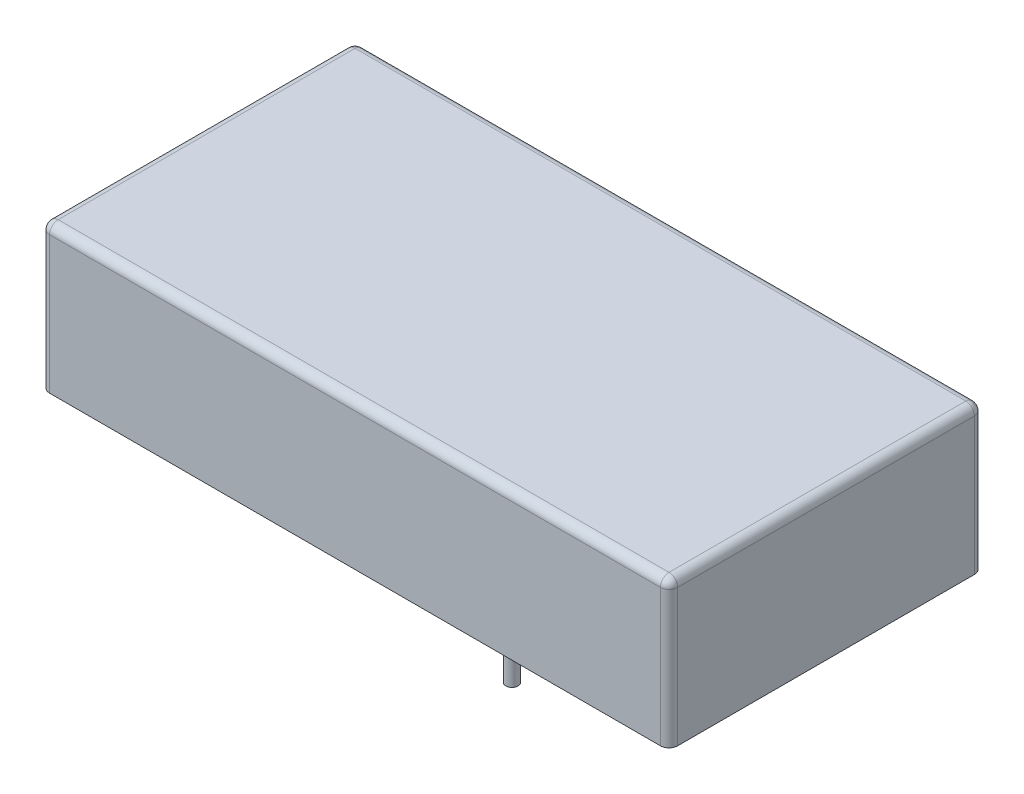
ISO-10303-21;
HEADER;
FILE_DESCRIPTION(('STEP AP214'),'2;1');
FILE_NAME('part.step','',(''),(''),'','','');
FILE_SCHEMA(('AUTOMOTIVE_DESIGN { 1 0 10303 214 1 1 1 1 }'));
ENDSEC;
DATA;
#1=APPLICATION_CONTEXT('core data for automotive mechanical design processes');
#2=APPLICATION_PROTOCOL_DEFINITION('international standard','automotive_design',2000,#1);
#3=PRODUCT_CONTEXT('',#1,'mechanical');
#4=PRODUCT('Part','Part','',(#3));
#5=PRODUCT_RELATED_PRODUCT_CATEGORY('part','',(#4));
#6=PRODUCT_DEFINITION_FORMATION('','',#4);
#7=PRODUCT_DEFINITION_CONTEXT('part definition',#1,'design');
#8=PRODUCT_DEFINITION('design','',#6,#7);
#9=PRODUCT_DEFINITION_SHAPE('','',#8);
#10=(LENGTH_UNIT() NAMED_UNIT(*) SI_UNIT(.MILLI.,.METRE.));
#11=(NAMED_UNIT(*) PLANE_ANGLE_UNIT() SI_UNIT($,.RADIAN.));
#12=(NAMED_UNIT(*) SI_UNIT($,.STERADIAN.) SOLID_ANGLE_UNIT());
#13=UNCERTAINTY_MEASURE_WITH_UNIT(LENGTH_MEASURE(1.E-05),#10,'distance_accuracy_value','');
#14=(GEOMETRIC_REPRESENTATION_CONTEXT(3) GLOBAL_UNCERTAINTY_ASSIGNED_CONTEXT((#13)) GLOBAL_UNIT_ASSIGNED_CONTEXT((#10,
#11,#12)) REPRESENTATION_CONTEXT('',''));
#15=CARTESIAN_POINT('',(0.,0.,0.));
#16=DIRECTION('',(0.,0.,1.));
#17=DIRECTION('',(1.,0.,0.));
#18=AXIS2_PLACEMENT_3D('',#15,#16,#17);
#19=CARTESIAN_POINT('',(20.3223872720577,19.9,2.30900937106401));
#20=DIRECTION('',(0.885738530445474,0.397567124128241,0.239598909631686));
#21=DIRECTION('',(0.2640178534715,-0.0069406075380161,-0.964492820613666));
#22=AXIS2_PLACEMENT_3D('',#19,#20,#21);
#23=SPHERICAL_SURFACE('',#22,0.7);
#24=CARTESIAN_POINT('',(20.9424042433696,20.1782969868898,2.47672860780619));
#25=VERTEX_POINT('',#24);
#26=VERTEX_LOOP('',#25);
#27=FACE_BOUND('',#26,.T.);
#28=CARTESIAN_POINT('',(20.3223872720577,19.9,2.30900937106401));
#29=DIRECTION('',(0.,1.,0.));
#30=DIRECTION('',(0.,0.,1.));
#31=AXIS2_PLACEMENT_3D('',#28,#29,#30);
#32=CIRCLE('',#31,0.699999999999999);
#33=CARTESIAN_POINT('',(21.0223872720577,19.9,2.30900937106401));
#34=VERTEX_POINT('',#33);
#35=CARTESIAN_POINT('',(20.3223872720577,19.9,3.00900937106401));
#36=VERTEX_POINT('',#35);
#37=EDGE_CURVE('E93',#34,#36,#32,.F.);
#38=ORIENTED_EDGE('',*,*,#37,.F.);
#39=CARTESIAN_POINT('',(20.3223872720577,19.9,2.30900937106401));
#40=DIRECTION('',(0.,0.,-1.));
#41=DIRECTION('',(-1.,0.,0.));
#42=AXIS2_PLACEMENT_3D('',#39,#40,#41);
#43=CIRCLE('',#42,0.699999999999999);
#44=CARTESIAN_POINT('',(20.3223872720577,20.6,2.30900937106401));
#45=VERTEX_POINT('',#44);
#46=EDGE_CURVE('E108',#45,#34,#43,.T.);
#47=ORIENTED_EDGE('',*,*,#46,.F.);
#48=CARTESIAN_POINT('',(20.3223872720577,19.9,2.30900937106401));
#49=DIRECTION('',(1.,0.,0.));
#50=DIRECTION('',(0.,0.,-1.));
#51=AXIS2_PLACEMENT_3D('',#48,#49,#50);
#52=CIRCLE('',#51,0.699999999999999);
#53=EDGE_CURVE('E20',#36,#45,#52,.F.);
#54=ORIENTED_EDGE('',*,*,#53,.F.);
#55=EDGE_LOOP('',(#38,#47,#54));
#56=FACE_BOUND('',#55,.T.);
#57=ADVANCED_FACE('F16',(#27,#56),#23,.T.);
#58=CARTESIAN_POINT('',(20.3223872720577,19.9,-21.690990628936));
#59=DIRECTION('',(0.885738530445474,0.397567124128241,0.239598909631686));
#60=DIRECTION('',(0.2640178534715,-0.0069406075380161,-0.964492820613666));
#61=AXIS2_PLACEMENT_3D('',#58,#59,#60);
#62=SPHERICAL_SURFACE('',#61,0.7);
#63=CARTESIAN_POINT('',(20.3223872720577,19.9,-21.690990628936));
#64=DIRECTION('',(0.,1.,0.));
#65=DIRECTION('',(0.,0.,1.));
#66=AXIS2_PLACEMENT_3D('',#63,#64,#65);
#67=CIRCLE('',#66,0.699999999999999);
#68=CARTESIAN_POINT('',(20.3223872720577,19.9,-22.390990628936));
#69=VERTEX_POINT('',#68);
#70=CARTESIAN_POINT('',(21.0223872720577,19.9,-21.690990628936));
#71=VERTEX_POINT('',#70);
#72=EDGE_CURVE('E214',#69,#71,#67,.F.);
#73=ORIENTED_EDGE('',*,*,#72,.F.);
#74=CARTESIAN_POINT('',(20.3223872720577,19.9,-21.690990628936));
#75=DIRECTION('',(-1.,0.,0.));
#76=DIRECTION('',(0.,0.,1.));
#77=AXIS2_PLACEMENT_3D('',#74,#75,#76);
#78=CIRCLE('',#77,0.699999999999999);
#79=CARTESIAN_POINT('',(20.3223872720577,20.6,-21.690990628936));
#80=VERTEX_POINT('',#79);
#81=EDGE_CURVE('E212',#80,#69,#78,.T.);
#82=ORIENTED_EDGE('',*,*,#81,.F.);
#83=CARTESIAN_POINT('',(20.3223872720577,19.9,-21.690990628936));
#84=DIRECTION('',(0.,0.,-1.));
#85=DIRECTION('',(-1.,0.,0.));
#86=AXIS2_PLACEMENT_3D('',#83,#84,#85);
#87=CIRCLE('',#86,0.699999999999999);
#88=EDGE_CURVE('E163',#71,#80,#87,.F.);
#89=ORIENTED_EDGE('',*,*,#88,.F.);
#90=EDGE_LOOP('',(#73,#82,#89));
#91=FACE_BOUND('',#90,.T.);
#92=ADVANCED_FACE('F150',(#91),#62,.T.);
#93=CARTESIAN_POINT('',(-29.0776127279423,19.9,2.30900937106401));
#94=DIRECTION('',(0.885738530445474,0.397567124128241,0.239598909631686));
#95=DIRECTION('',(0.2640178534715,-0.0069406075380161,-0.964492820613666));
#96=AXIS2_PLACEMENT_3D('',#93,#94,#95);
#97=SPHERICAL_SURFACE('',#96,0.7);
#98=CARTESIAN_POINT('',(-29.0776127279423,19.9,2.30900937106401));
#99=DIRECTION('',(1.,0.,0.));
#100=DIRECTION('',(0.,0.,-1.));
#101=AXIS2_PLACEMENT_3D('',#98,#99,#100);
#102=CIRCLE('',#101,0.699999999999999);
#103=CARTESIAN_POINT('',(-29.0776127279423,20.6,2.30900937106401));
#104=VERTEX_POINT('',#103);
#105=CARTESIAN_POINT('',(-29.0776127279423,19.9,3.00900937106401));
#106=VERTEX_POINT('',#105);
#107=EDGE_CURVE('E105',#104,#106,#102,.T.);
#108=ORIENTED_EDGE('',*,*,#107,.F.);
#109=CARTESIAN_POINT('',(-29.0776127279423,19.9,2.30900937106401));
#110=DIRECTION('',(0.,0.,1.));
#111=DIRECTION('',(1.,0.,0.));
#112=AXIS2_PLACEMENT_3D('',#109,#110,#111);
#113=CIRCLE('',#112,0.699999999999999);
#114=CARTESIAN_POINT('',(-29.7776127279423,19.9,2.30900937106401));
#115=VERTEX_POINT('',#114);
#116=EDGE_CURVE('E202',#115,#104,#113,.F.);
#117=ORIENTED_EDGE('',*,*,#116,.F.);
#118=CARTESIAN_POINT('',(-29.0776127279423,19.9,2.30900937106401));
#119=DIRECTION('',(0.,1.,0.));
#120=DIRECTION('',(0.,0.,1.));
#121=AXIS2_PLACEMENT_3D('',#118,#119,#120);
#122=CIRCLE('',#121,0.699999999999999);
#123=EDGE_CURVE('E208',#106,#115,#122,.F.);
#124=ORIENTED_EDGE('',*,*,#123,.F.);
#125=EDGE_LOOP('',(#108,#117,#124));
#126=FACE_BOUND('',#125,.T.);
#127=ADVANCED_FACE('F147',(#126),#97,.T.);
#128=CARTESIAN_POINT('',(-29.7776127279423,20.6,3.00900937106401));
#129=DIRECTION('',(0.,1.,0.));
#130=DIRECTION('',(0.,0.,1.));
#131=AXIS2_PLACEMENT_3D('',#128,#129,#130);
#132=PLANE('',#131);
#133=DIRECTION('',(-1.,0.,0.));
#134=VECTOR('',#133,1.);
#135=CARTESIAN_POINT('',(-29.7776127279423,20.6,-21.690990628936));
#136=LINE('',#135,#134);
#137=CARTESIAN_POINT('',(-29.0776127279423,20.6,-21.690990628936));
#138=VERTEX_POINT('',#137);
#139=EDGE_CURVE('E155',#138,#80,#136,.F.);
#140=ORIENTED_EDGE('',*,*,#139,.F.);
#141=DIRECTION('',(0.,0.,1.));
#142=VECTOR('',#141,1.);
#143=CARTESIAN_POINT('',(-29.0776127279423,20.6,3.00900937106401));
#144=LINE('',#143,#142);
#145=EDGE_CURVE('E135',#104,#138,#144,.F.);
#146=ORIENTED_EDGE('',*,*,#145,.F.);
#147=DIRECTION('',(1.,0.,0.));
#148=VECTOR('',#147,1.);
#149=CARTESIAN_POINT('',(-29.7776127279423,20.6,2.30900937106401));
#150=LINE('',#149,#148);
#151=EDGE_CURVE('E112',#45,#104,#150,.F.);
#152=ORIENTED_EDGE('',*,*,#151,.F.);
#153=DIRECTION('',(0.,0.,-1.));
#154=VECTOR('',#153,1.);
#155=CARTESIAN_POINT('',(20.3223872720577,20.6,3.009009371064));
#156=LINE('',#155,#154);
#157=EDGE_CURVE('E161',#80,#45,#156,.F.);
#158=ORIENTED_EDGE('',*,*,#157,.F.);
#159=EDGE_LOOP('',(#140,#146,#152,#158));
#160=FACE_BOUND('',#159,.T.);
#161=ADVANCED_FACE('F142',(#160),#132,.T.);
#162=CARTESIAN_POINT('',(-29.0776127279423,19.9,-21.690990628936));
#163=DIRECTION('',(0.885738530445474,0.397567124128241,0.239598909631686));
#164=DIRECTION('',(0.2640178534715,-0.0069406075380161,-0.964492820613666));
#165=AXIS2_PLACEMENT_3D('',#162,#163,#164);
#166=SPHERICAL_SURFACE('',#165,0.7);
#167=CARTESIAN_POINT('',(-29.0776127279423,19.9,-21.690990628936));
#168=DIRECTION('',(-1.,0.,0.));
#169=DIRECTION('',(0.,0.,1.));
#170=AXIS2_PLACEMENT_3D('',#167,#168,#169);
#171=CIRCLE('',#170,0.699999999999999);
#172=CARTESIAN_POINT('',(-29.0776127279423,19.9,-22.390990628936));
#173=VERTEX_POINT('',#172);
#174=EDGE_CURVE('E158',#173,#138,#171,.F.);
#175=ORIENTED_EDGE('',*,*,#174,.F.);
#176=CARTESIAN_POINT('',(-29.0776127279423,19.9,-21.690990628936));
#177=DIRECTION('',(0.,1.,0.));
#178=DIRECTION('',(0.,0.,1.));
#179=AXIS2_PLACEMENT_3D('',#176,#177,#178);
#180=CIRCLE('',#179,0.699999999999999);
#181=CARTESIAN_POINT('',(-29.7776127279423,19.9,-21.690990628936));
#182=VERTEX_POINT('',#181);
#183=EDGE_CURVE('E206',#182,#173,#180,.F.);
#184=ORIENTED_EDGE('',*,*,#183,.F.);
#185=CARTESIAN_POINT('',(-29.0776127279423,19.9,-21.690990628936));
#186=DIRECTION('',(0.,0.,1.));
#187=DIRECTION('',(1.,0.,0.));
#188=AXIS2_PLACEMENT_3D('',#185,#186,#187);
#189=CIRCLE('',#188,0.699999999999999);
#190=EDGE_CURVE('E127',#138,#182,#189,.T.);
#191=ORIENTED_EDGE('',*,*,#190,.F.);
#192=EDGE_LOOP('',(#175,#184,#191));
#193=FACE_BOUND('',#192,.T.);
#194=ADVANCED_FACE('F138',(#193),#166,.T.);
#195=CARTESIAN_POINT('',(-29.7776127279423,19.9,2.30900937106401));
#196=DIRECTION('',(1.,0.,0.));
#197=DIRECTION('',(0.,0.,-1.));
#198=AXIS2_PLACEMENT_3D('',#195,#196,#197);
#199=CYLINDRICAL_SURFACE('',#198,0.699999999999999);
#200=ORIENTED_EDGE('',*,*,#107,.T.);
#201=DIRECTION('',(-1.,0.,0.));
#202=VECTOR('',#201,1.);
#203=CARTESIAN_POINT('',(-29.7776127279423,19.9,3.00900937106401));
#204=LINE('',#203,#202);
#205=EDGE_CURVE('E117',#106,#36,#204,.F.);
#206=ORIENTED_EDGE('',*,*,#205,.T.);
#207=ORIENTED_EDGE('',*,*,#53,.T.);
#208=ORIENTED_EDGE('',*,*,#151,.T.);
#209=EDGE_LOOP('',(#200,#206,#207,#208));
#210=FACE_BOUND('',#209,.T.);
#211=ADVANCED_FACE('F122',(#210),#199,.T.);
#212=CARTESIAN_POINT('',(20.3223872720577,20.6,2.30900937106401));
#213=DIRECTION('',(0.,1.,0.));
#214=DIRECTION('',(0.,0.,1.));
#215=AXIS2_PLACEMENT_3D('',#212,#213,#214);
#216=CYLINDRICAL_SURFACE('',#215,0.699999999999999);
#217=CARTESIAN_POINT('',(20.3223872720577,8.8,2.30900937106401));
#218=DIRECTION('',(0.,1.,0.));
#219=DIRECTION('',(0.,0.,1.));
#220=AXIS2_PLACEMENT_3D('',#217,#218,#219);
#221=CIRCLE('',#220,0.699999999999999);
#222=CARTESIAN_POINT('',(20.3223872720577,8.8,3.00900937106401));
#223=VERTEX_POINT('',#222);
#224=CARTESIAN_POINT('',(21.0223872720577,8.8,2.30900937106401));
#225=VERTEX_POINT('',#224);
#226=EDGE_CURVE('E104',#223,#225,#221,.T.);
#227=ORIENTED_EDGE('',*,*,#226,.T.);
#228=DIRECTION('',(0.,1.,0.));
#229=VECTOR('',#228,1.);
#230=CARTESIAN_POINT('',(21.0223872720577,20.6,2.30900937106401));
#231=LINE('',#230,#229);
#232=EDGE_CURVE('E100',#225,#34,#231,.T.);
#233=ORIENTED_EDGE('',*,*,#232,.T.);
#234=ORIENTED_EDGE('',*,*,#37,.T.);
#235=DIRECTION('',(0.,1.,0.));
#236=VECTOR('',#235,1.);
#237=CARTESIAN_POINT('',(20.3223872720577,20.6,3.00900937106401));
#238=LINE('',#237,#236);
#239=EDGE_CURVE('E97',#36,#223,#238,.F.);
#240=ORIENTED_EDGE('',*,*,#239,.T.);
#241=EDGE_LOOP('',(#227,#233,#234,#240));
#242=FACE_BOUND('',#241,.T.);
#243=ADVANCED_FACE('F95',(#242),#216,.T.);
#244=CARTESIAN_POINT('',(20.3223872720577,19.9,3.009009371064));
#245=DIRECTION('',(0.,0.,-1.));
#246=DIRECTION('',(-1.,0.,0.));
#247=AXIS2_PLACEMENT_3D('',#244,#245,#246);
#248=CYLINDRICAL_SURFACE('',#247,0.699999999999999);
#249=ORIENTED_EDGE('',*,*,#88,.T.);
#250=ORIENTED_EDGE('',*,*,#157,.T.);
#251=ORIENTED_EDGE('',*,*,#46,.T.);
#252=DIRECTION('',(0.,0.,1.));
#253=VECTOR('',#252,1.);
#254=CARTESIAN_POINT('',(21.0223872720577,19.9,-22.390990628936));
#255=LINE('',#254,#253);
#256=EDGE_CURVE('E131',#34,#71,#255,.F.);
#257=ORIENTED_EDGE('',*,*,#256,.T.);
#258=EDGE_LOOP('',(#249,#250,#251,#257));
#259=FACE_BOUND('',#258,.T.);
#260=ADVANCED_FACE('F268',(#259),#248,.T.);
#261=CARTESIAN_POINT('',(20.3223872720577,20.6,-21.690990628936));
#262=DIRECTION('',(0.,1.,0.));
#263=DIRECTION('',(0.,0.,1.));
#264=AXIS2_PLACEMENT_3D('',#261,#262,#263);
#265=CYLINDRICAL_SURFACE('',#264,0.699999999999999);
#266=ORIENTED_EDGE('',*,*,#72,.T.);
#267=DIRECTION('',(0.,1.,0.));
#268=VECTOR('',#267,1.);
#269=CARTESIAN_POINT('',(21.0223872720577,20.6,-21.690990628936));
#270=LINE('',#269,#268);
#271=CARTESIAN_POINT('',(21.0223872720577,8.8,-21.690990628936));
#272=VERTEX_POINT('',#271);
#273=EDGE_CURVE('E248',#71,#272,#270,.F.);
#274=ORIENTED_EDGE('',*,*,#273,.T.);
#275=CARTESIAN_POINT('',(20.3223872720577,8.8,-21.690990628936));
#276=DIRECTION('',(0.,1.,0.));
#277=DIRECTION('',(0.,0.,1.));
#278=AXIS2_PLACEMENT_3D('',#275,#276,#277);
#279=CIRCLE('',#278,0.699999999999999);
#280=CARTESIAN_POINT('',(20.3223872720577,8.8,-22.390990628936));
#281=VERTEX_POINT('',#280);
#282=EDGE_CURVE('E162',#272,#281,#279,.T.);
#283=ORIENTED_EDGE('',*,*,#282,.T.);
#284=DIRECTION('',(0.,1.,0.));
#285=VECTOR('',#284,1.);
#286=CARTESIAN_POINT('',(20.3223872720577,20.6,-22.390990628936));
#287=LINE('',#286,#285);
#288=EDGE_CURVE('E244',#281,#69,#287,.T.);
#289=ORIENTED_EDGE('',*,*,#288,.T.);
#290=EDGE_LOOP('',(#266,#274,#283,#289));
#291=FACE_BOUND('',#290,.T.);
#292=ADVANCED_FACE('F265',(#291),#265,.T.);
#293=CARTESIAN_POINT('',(-29.7776127279423,19.9,-21.690990628936));
#294=DIRECTION('',(-1.,0.,0.));
#295=DIRECTION('',(0.,0.,1.));
#296=AXIS2_PLACEMENT_3D('',#293,#294,#295);
#297=CYLINDRICAL_SURFACE('',#296,0.699999999999999);
#298=ORIENTED_EDGE('',*,*,#174,.T.);
#299=ORIENTED_EDGE('',*,*,#139,.T.);
#300=ORIENTED_EDGE('',*,*,#81,.T.);
#301=DIRECTION('',(1.,0.,0.));
#302=VECTOR('',#301,1.);
#303=CARTESIAN_POINT('',(-29.7776127279423,19.9,-22.390990628936));
#304=LINE('',#303,#302);
#305=EDGE_CURVE('E247',#69,#173,#304,.F.);
#306=ORIENTED_EDGE('',*,*,#305,.T.);
#307=EDGE_LOOP('',(#298,#299,#300,#306));
#308=FACE_BOUND('',#307,.T.);
#309=ADVANCED_FACE('F255',(#308),#297,.T.);
#310=CARTESIAN_POINT('',(-29.0776127279423,20.6,2.30900937106401));
#311=DIRECTION('',(0.,1.,0.));
#312=DIRECTION('',(0.,0.,1.));
#313=AXIS2_PLACEMENT_3D('',#310,#311,#312);
#314=CYLINDRICAL_SURFACE('',#313,0.699999999999999);
#315=ORIENTED_EDGE('',*,*,#123,.T.);
#316=DIRECTION('',(0.,1.,0.));
#317=VECTOR('',#316,1.);
#318=CARTESIAN_POINT('',(-29.7776127279423,20.6,2.30900937106401));
#319=LINE('',#318,#317);
#320=CARTESIAN_POINT('',(-29.7776127279423,8.8,2.30900937106401));
#321=VERTEX_POINT('',#320);
#322=EDGE_CURVE('E240',#115,#321,#319,.F.);
#323=ORIENTED_EDGE('',*,*,#322,.T.);
#324=CARTESIAN_POINT('',(-29.0776127279423,8.8,2.30900937106401));
#325=DIRECTION('',(0.,1.,0.));
#326=DIRECTION('',(0.,0.,1.));
#327=AXIS2_PLACEMENT_3D('',#324,#325,#326);
#328=CIRCLE('',#327,0.699999999999999);
#329=CARTESIAN_POINT('',(-29.0776127279423,8.8,3.00900937106401));
#330=VERTEX_POINT('',#329);
#331=EDGE_CURVE('E157',#321,#330,#328,.T.);
#332=ORIENTED_EDGE('',*,*,#331,.T.);
#333=DIRECTION('',(0.,1.,0.));
#334=VECTOR('',#333,1.);
#335=CARTESIAN_POINT('',(-29.0776127279423,20.6,3.00900937106401));
#336=LINE('',#335,#334);
#337=EDGE_CURVE('E125',#330,#106,#336,.T.);
#338=ORIENTED_EDGE('',*,*,#337,.T.);
#339=EDGE_LOOP('',(#315,#323,#332,#338));
#340=FACE_BOUND('',#339,.T.);
#341=ADVANCED_FACE('F281',(#340),#314,.T.);
#342=CARTESIAN_POINT('',(-29.0776127279423,20.6,-21.690990628936));
#343=DIRECTION('',(0.,1.,0.));
#344=DIRECTION('',(0.,0.,1.));
#345=AXIS2_PLACEMENT_3D('',#342,#343,#344);
#346=CYLINDRICAL_SURFACE('',#345,0.699999999999999);
#347=CARTESIAN_POINT('',(-29.0776127279423,8.8,-21.690990628936));
#348=DIRECTION('',(0.,1.,0.));
#349=DIRECTION('',(0.,0.,1.));
#350=AXIS2_PLACEMENT_3D('',#347,#348,#349);
#351=CIRCLE('',#350,0.699999999999999);
#352=CARTESIAN_POINT('',(-29.0776127279423,8.8,-22.390990628936));
#353=VERTEX_POINT('',#352);
#354=CARTESIAN_POINT('',(-29.7776127279423,8.8,-21.690990628936));
#355=VERTEX_POINT('',#354);
#356=EDGE_CURVE('E35',#353,#355,#351,.T.);
#357=ORIENTED_EDGE('',*,*,#356,.T.);
#358=DIRECTION('',(0.,1.,0.));
#359=VECTOR('',#358,1.);
#360=CARTESIAN_POINT('',(-29.7776127279423,20.6,-21.690990628936));
#361=LINE('',#360,#359);
#362=EDGE_CURVE('E238',#355,#182,#361,.T.);
#363=ORIENTED_EDGE('',*,*,#362,.T.);
#364=ORIENTED_EDGE('',*,*,#183,.T.);
#365=DIRECTION('',(0.,1.,0.));
#366=VECTOR('',#365,1.);
#367=CARTESIAN_POINT('',(-29.0776127279423,20.6,-22.390990628936));
#368=LINE('',#367,#366);
#369=EDGE_CURVE('E243',#173,#353,#368,.F.);
#370=ORIENTED_EDGE('',*,*,#369,.T.);
#371=EDGE_LOOP('',(#357,#363,#364,#370));
#372=FACE_BOUND('',#371,.T.);
#373=ADVANCED_FACE('F286',(#372),#346,.T.);
#374=CARTESIAN_POINT('',(-29.0776127279423,19.9,3.00900937106401));
#375=DIRECTION('',(0.,0.,1.));
#376=DIRECTION('',(1.,0.,0.));
#377=AXIS2_PLACEMENT_3D('',#374,#375,#376);
#378=CYLINDRICAL_SURFACE('',#377,0.699999999999999);
#379=ORIENTED_EDGE('',*,*,#190,.T.);
#380=DIRECTION('',(0.,0.,-1.));
#381=VECTOR('',#380,1.);
#382=CARTESIAN_POINT('',(-29.7776127279423,19.9,-22.390990628936));
#383=LINE('',#382,#381);
#384=EDGE_CURVE('E200',#182,#115,#383,.F.);
#385=ORIENTED_EDGE('',*,*,#384,.T.);
#386=ORIENTED_EDGE('',*,*,#116,.T.);
#387=ORIENTED_EDGE('',*,*,#145,.T.);
#388=EDGE_LOOP('',(#379,#385,#386,#387));
#389=FACE_BOUND('',#388,.T.);
#390=ADVANCED_FACE('F277',(#389),#378,.T.);
#391=CARTESIAN_POINT('',(5.78238727205773,4.7,-9.69099062893597));
#392=DIRECTION('',(0.,-1.,0.));
#393=DIRECTION('',(0.,0.,-1.));
#394=AXIS2_PLACEMENT_3D('',#391,#392,#393);
#395=PLANE('',#394);
#396=CARTESIAN_POINT('',(5.78238727205773,4.7,-9.69099062893597));
#397=DIRECTION('',(0.,-1.,0.));
#398=DIRECTION('',(0.,0.,-1.));
#399=AXIS2_PLACEMENT_3D('',#396,#397,#398);
#400=CIRCLE('',#399,0.500000000000001);
#401=CARTESIAN_POINT('',(5.78238727205773,4.7,-10.190990628936));
#402=VERTEX_POINT('',#401);
#403=EDGE_CURVE('E197',#402,#402,#400,.F.);
#404=ORIENTED_EDGE('',*,*,#403,.F.);
#405=EDGE_LOOP('',(#404));
#406=FACE_BOUND('',#405,.T.);
#407=ADVANCED_FACE('F295',(#406),#395,.T.);
#408=CARTESIAN_POINT('',(-14.5376127279423,4.7,-7.15099062893596));
#409=DIRECTION('',(0.,-1.,0.));
#410=DIRECTION('',(0.,0.,-1.));
#411=AXIS2_PLACEMENT_3D('',#408,#409,#410);
#412=PLANE('',#411);
#413=CARTESIAN_POINT('',(-14.5376127279423,4.7,-7.15099062893596));
#414=DIRECTION('',(0.,-1.,0.));
#415=DIRECTION('',(0.,0.,-1.));
#416=AXIS2_PLACEMENT_3D('',#413,#414,#415);
#417=CIRCLE('',#416,0.5);
#418=CARTESIAN_POINT('',(-14.5376127279423,4.7,-7.65099062893597));
#419=VERTEX_POINT('',#418);
#420=EDGE_CURVE('E194',#419,#419,#417,.F.);
#421=ORIENTED_EDGE('',*,*,#420,.F.);
#422=EDGE_LOOP('',(#421));
#423=FACE_BOUND('',#422,.T.);
#424=ADVANCED_FACE('F353',(#423),#412,.T.);
#425=CARTESIAN_POINT('',(-14.5376127279423,4.7,-19.850990628936));
#426=DIRECTION('',(0.,-1.,0.));
#427=DIRECTION('',(0.,0.,-1.));
#428=AXIS2_PLACEMENT_3D('',#425,#426,#427);
#429=PLANE('',#428);
#430=CARTESIAN_POINT('',(-14.5376127279423,4.7,-19.850990628936));
#431=DIRECTION('',(0.,-1.,0.));
#432=DIRECTION('',(0.,0.,-1.));
#433=AXIS2_PLACEMENT_3D('',#430,#431,#432);
#434=CIRCLE('',#433,0.5);
#435=CARTESIAN_POINT('',(-14.5376127279423,4.7,-20.350990628936));
#436=VERTEX_POINT('',#435);
#437=EDGE_CURVE('E191',#436,#436,#434,.F.);
#438=ORIENTED_EDGE('',*,*,#437,.F.);
#439=EDGE_LOOP('',(#438));
#440=FACE_BOUND('',#439,.T.);
#441=ADVANCED_FACE('F349',(#440),#429,.T.);
#442=CARTESIAN_POINT('',(-14.5376127279423,4.7,-12.230990628936));
#443=DIRECTION('',(0.,-1.,0.));
#444=DIRECTION('',(0.,0.,-1.));
#445=AXIS2_PLACEMENT_3D('',#442,#443,#444);
#446=PLANE('',#445);
#447=CARTESIAN_POINT('',(-14.5376127279423,4.7,-12.230990628936));
#448=DIRECTION('',(0.,-1.,0.));
#449=DIRECTION('',(0.,0.,-1.));
#450=AXIS2_PLACEMENT_3D('',#447,#448,#449);
#451=CIRCLE('',#450,0.5);
#452=CARTESIAN_POINT('',(-14.5376127279423,4.7,-12.730990628936));
#453=VERTEX_POINT('',#452);
#454=EDGE_CURVE('E188',#453,#453,#451,.F.);
#455=ORIENTED_EDGE('',*,*,#454,.F.);
#456=EDGE_LOOP('',(#455));
#457=FACE_BOUND('',#456,.T.);
#458=ADVANCED_FACE('F345',(#457),#446,.T.);
#459=CARTESIAN_POINT('',(5.78238727205773,4.7,0.469009371064033));
#460=DIRECTION('',(0.,-1.,0.));
#461=DIRECTION('',(0.,0.,-1.));
#462=AXIS2_PLACEMENT_3D('',#459,#460,#461);
#463=PLANE('',#462);
#464=CARTESIAN_POINT('',(5.78238727205773,4.7,0.469009371064033));
#465=DIRECTION('',(0.,-1.,0.));
#466=DIRECTION('',(0.,0.,-1.));
#467=AXIS2_PLACEMENT_3D('',#464,#465,#466);
#468=CIRCLE('',#467,0.5);
#469=CARTESIAN_POINT('',(5.78238727205773,4.7,-0.0309906289359678));
#470=VERTEX_POINT('',#469);
#471=EDGE_CURVE('E185',#470,#470,#468,.F.);
#472=ORIENTED_EDGE('',*,*,#471,.F.);
#473=EDGE_LOOP('',(#472));
#474=FACE_BOUND('',#473,.T.);
#475=ADVANCED_FACE('F341',(#474),#463,.T.);
#476=CARTESIAN_POINT('',(5.78238727205773,4.7,-19.850990628936));
#477=DIRECTION('',(0.,-1.,0.));
#478=DIRECTION('',(0.,0.,-1.));
#479=AXIS2_PLACEMENT_3D('',#476,#477,#478);
#480=PLANE('',#479);
#481=CARTESIAN_POINT('',(5.78238727205773,4.7,-19.850990628936));
#482=DIRECTION('',(0.,-1.,0.));
#483=DIRECTION('',(0.,0.,-1.));
#484=AXIS2_PLACEMENT_3D('',#481,#482,#483);
#485=CIRCLE('',#484,0.500000000000002);
#486=CARTESIAN_POINT('',(5.78238727205773,4.7,-20.350990628936));
#487=VERTEX_POINT('',#486);
#488=EDGE_CURVE('E182',#487,#487,#485,.F.);
#489=ORIENTED_EDGE('',*,*,#488,.F.);
#490=EDGE_LOOP('',(#489));
#491=FACE_BOUND('',#490,.T.);
#492=ADVANCED_FACE('F338',(#491),#480,.T.);
#493=CARTESIAN_POINT('',(-29.7776127279423,20.6,3.00900937106401));
#494=DIRECTION('',(0.,0.,-1.));
#495=DIRECTION('',(-1.,0.,0.));
#496=AXIS2_PLACEMENT_3D('',#493,#494,#495);
#497=PLANE('',#496);
#498=ORIENTED_EDGE('',*,*,#239,.F.);
#499=ORIENTED_EDGE('',*,*,#205,.F.);
#500=ORIENTED_EDGE('',*,*,#337,.F.);
#501=DIRECTION('',(1.,0.,0.));
#502=VECTOR('',#501,1.);
#503=CARTESIAN_POINT('',(-29.7776127279423,8.8,3.00900937106401));
#504=LINE('',#503,#502);
#505=EDGE_CURVE('E120',#330,#223,#504,.T.);
#506=ORIENTED_EDGE('',*,*,#505,.T.);
#507=EDGE_LOOP('',(#498,#499,#500,#506));
#508=FACE_BOUND('',#507,.T.);
#509=ADVANCED_FACE('F115',(#508),#497,.F.);
#510=CARTESIAN_POINT('',(21.0223872720577,20.6,-22.390990628936));
#511=DIRECTION('',(-1.,0.,0.));
#512=DIRECTION('',(0.,0.,1.));
#513=AXIS2_PLACEMENT_3D('',#510,#511,#512);
#514=PLANE('',#513);
#515=ORIENTED_EDGE('',*,*,#273,.F.);
#516=ORIENTED_EDGE('',*,*,#256,.F.);
#517=ORIENTED_EDGE('',*,*,#232,.F.);
#518=DIRECTION('',(0.,0.,1.));
#519=VECTOR('',#518,1.);
#520=CARTESIAN_POINT('',(21.0223872720577,8.8,3.00900937106401));
#521=LINE('',#520,#519);
#522=EDGE_CURVE('E225',#225,#272,#521,.F.);
#523=ORIENTED_EDGE('',*,*,#522,.T.);
#524=EDGE_LOOP('',(#515,#516,#517,#523));
#525=FACE_BOUND('',#524,.T.);
#526=ADVANCED_FACE('F224',(#525),#514,.F.);
#527=CARTESIAN_POINT('',(-29.7776127279423,20.6,-22.390990628936));
#528=DIRECTION('',(0.,0.,1.));
#529=DIRECTION('',(1.,0.,0.));
#530=AXIS2_PLACEMENT_3D('',#527,#528,#529);
#531=PLANE('',#530);
#532=ORIENTED_EDGE('',*,*,#369,.F.);
#533=ORIENTED_EDGE('',*,*,#305,.F.);
#534=ORIENTED_EDGE('',*,*,#288,.F.);
#535=DIRECTION('',(1.,0.,0.));
#536=VECTOR('',#535,1.);
#537=CARTESIAN_POINT('',(-29.7776127279423,8.8,-22.390990628936));
#538=LINE('',#537,#536);
#539=EDGE_CURVE('E231',#281,#353,#538,.F.);
#540=ORIENTED_EDGE('',*,*,#539,.T.);
#541=EDGE_LOOP('',(#532,#533,#534,#540));
#542=FACE_BOUND('',#541,.T.);
#543=ADVANCED_FACE('F263',(#542),#531,.F.);
#544=CARTESIAN_POINT('',(-29.7776127279423,20.6,-22.390990628936));
#545=DIRECTION('',(1.,0.,0.));
#546=DIRECTION('',(0.,0.,-1.));
#547=AXIS2_PLACEMENT_3D('',#544,#545,#546);
#548=PLANE('',#547);
#549=ORIENTED_EDGE('',*,*,#362,.F.);
#550=DIRECTION('',(0.,0.,1.));
#551=VECTOR('',#550,1.);
#552=CARTESIAN_POINT('',(-29.7776127279423,8.8,3.00900937106401));
#553=LINE('',#552,#551);
#554=EDGE_CURVE('E181',#355,#321,#553,.T.);
#555=ORIENTED_EDGE('',*,*,#554,.T.);
#556=ORIENTED_EDGE('',*,*,#322,.F.);
#557=ORIENTED_EDGE('',*,*,#384,.F.);
#558=EDGE_LOOP('',(#549,#555,#556,#557));
#559=FACE_BOUND('',#558,.T.);
#560=ADVANCED_FACE('F284',(#559),#548,.F.);
#561=CARTESIAN_POINT('',(5.78238727205773,4.7,-9.69099062893597));
#562=DIRECTION('',(0.,-1.,0.));
#563=DIRECTION('',(0.,0.,-1.));
#564=AXIS2_PLACEMENT_3D('',#561,#562,#563);
#565=CYLINDRICAL_SURFACE('',#564,0.500000000000001);
#566=CARTESIAN_POINT('',(5.78238727205773,8.8,-9.69099062893597));
#567=DIRECTION('',(0.,-1.,0.));
#568=DIRECTION('',(0.,0.,-1.));
#569=AXIS2_PLACEMENT_3D('',#566,#567,#568);
#570=CIRCLE('',#569,0.500000000000001);
#571=CARTESIAN_POINT('',(5.78238727205773,8.8,-10.190990628936));
#572=VERTEX_POINT('',#571);
#573=EDGE_CURVE('E178',#572,#572,#570,.T.);
#574=ORIENTED_EDGE('',*,*,#573,.T.);
#575=EDGE_LOOP('',(#574));
#576=FACE_BOUND('',#575,.T.);
#577=ORIENTED_EDGE('',*,*,#403,.T.);
#578=EDGE_LOOP('',(#577));
#579=FACE_BOUND('',#578,.T.);
#580=ADVANCED_FACE('F325',(#576,#579),#565,.T.);
#581=CARTESIAN_POINT('',(-14.5376127279423,4.7,-7.15099062893596));
#582=DIRECTION('',(0.,-1.,0.));
#583=DIRECTION('',(0.,0.,-1.));
#584=AXIS2_PLACEMENT_3D('',#581,#582,#583);
#585=CYLINDRICAL_SURFACE('',#584,0.5);
#586=CARTESIAN_POINT('',(-14.5376127279423,8.8,-7.15099062893596));
#587=DIRECTION('',(0.,-1.,0.));
#588=DIRECTION('',(0.,0.,-1.));
#589=AXIS2_PLACEMENT_3D('',#586,#587,#588);
#590=CIRCLE('',#589,0.5);
#591=CARTESIAN_POINT('',(-14.5376127279423,8.8,-7.65099062893597));
#592=VERTEX_POINT('',#591);
#593=EDGE_CURVE('E175',#592,#592,#590,.T.);
#594=ORIENTED_EDGE('',*,*,#593,.T.);
#595=EDGE_LOOP('',(#594));
#596=FACE_BOUND('',#595,.T.);
#597=ORIENTED_EDGE('',*,*,#420,.T.);
#598=EDGE_LOOP('',(#597));
#599=FACE_BOUND('',#598,.T.);
#600=ADVANCED_FACE('F321',(#596,#599),#585,.T.);
#601=CARTESIAN_POINT('',(-14.5376127279423,4.7,-19.850990628936));
#602=DIRECTION('',(0.,-1.,0.));
#603=DIRECTION('',(0.,0.,-1.));
#604=AXIS2_PLACEMENT_3D('',#601,#602,#603);
#605=CYLINDRICAL_SURFACE('',#604,0.5);
#606=CARTESIAN_POINT('',(-14.5376127279423,8.8,-19.850990628936));
#607=DIRECTION('',(0.,-1.,0.));
#608=DIRECTION('',(0.,0.,-1.));
#609=AXIS2_PLACEMENT_3D('',#606,#607,#608);
#610=CIRCLE('',#609,0.5);
#611=CARTESIAN_POINT('',(-14.5376127279423,8.8,-20.350990628936));
#612=VERTEX_POINT('',#611);
#613=EDGE_CURVE('E172',#612,#612,#610,.T.);
#614=ORIENTED_EDGE('',*,*,#613,.T.);
#615=EDGE_LOOP('',(#614));
#616=FACE_BOUND('',#615,.T.);
#617=ORIENTED_EDGE('',*,*,#437,.T.);
#618=EDGE_LOOP('',(#617));
#619=FACE_BOUND('',#618,.T.);
#620=ADVANCED_FACE('F317',(#616,#619),#605,.T.);
#621=CARTESIAN_POINT('',(-14.5376127279423,4.7,-12.230990628936));
#622=DIRECTION('',(0.,-1.,0.));
#623=DIRECTION('',(0.,0.,-1.));
#624=AXIS2_PLACEMENT_3D('',#621,#622,#623);
#625=CYLINDRICAL_SURFACE('',#624,0.5);
#626=CARTESIAN_POINT('',(-14.5376127279423,8.8,-12.230990628936));
#627=DIRECTION('',(0.,-1.,0.));
#628=DIRECTION('',(0.,0.,-1.));
#629=AXIS2_PLACEMENT_3D('',#626,#627,#628);
#630=CIRCLE('',#629,0.5);
#631=CARTESIAN_POINT('',(-14.5376127279423,8.8,-12.730990628936));
#632=VERTEX_POINT('',#631);
#633=EDGE_CURVE('E169',#632,#632,#630,.T.);
#634=ORIENTED_EDGE('',*,*,#633,.T.);
#635=EDGE_LOOP('',(#634));
#636=FACE_BOUND('',#635,.T.);
#637=ORIENTED_EDGE('',*,*,#454,.T.);
#638=EDGE_LOOP('',(#637));
#639=FACE_BOUND('',#638,.T.);
#640=ADVANCED_FACE('F313',(#636,#639),#625,.T.);
#641=CARTESIAN_POINT('',(5.78238727205773,4.7,0.469009371064033));
#642=DIRECTION('',(0.,-1.,0.));
#643=DIRECTION('',(0.,0.,-1.));
#644=AXIS2_PLACEMENT_3D('',#641,#642,#643);
#645=CYLINDRICAL_SURFACE('',#644,0.5);
#646=CARTESIAN_POINT('',(5.78238727205773,8.8,0.469009371064033));
#647=DIRECTION('',(0.,-1.,0.));
#648=DIRECTION('',(0.,0.,-1.));
#649=AXIS2_PLACEMENT_3D('',#646,#647,#648);
#650=CIRCLE('',#649,0.5);
#651=CARTESIAN_POINT('',(5.78238727205773,8.8,-0.0309906289359678));
#652=VERTEX_POINT('',#651);
#653=EDGE_CURVE('E26',#652,#652,#650,.T.);
#654=ORIENTED_EDGE('',*,*,#653,.T.);
#655=EDGE_LOOP('',(#654));
#656=FACE_BOUND('',#655,.T.);
#657=ORIENTED_EDGE('',*,*,#471,.T.);
#658=EDGE_LOOP('',(#657));
#659=FACE_BOUND('',#658,.T.);
#660=ADVANCED_FACE('F305',(#656,#659),#645,.T.);
#661=CARTESIAN_POINT('',(5.78238727205773,4.7,-19.850990628936));
#662=DIRECTION('',(0.,-1.,0.));
#663=DIRECTION('',(0.,0.,-1.));
#664=AXIS2_PLACEMENT_3D('',#661,#662,#663);
#665=CYLINDRICAL_SURFACE('',#664,0.500000000000002);
#666=CARTESIAN_POINT('',(5.78238727205773,8.8,-19.850990628936));
#667=DIRECTION('',(0.,-1.,0.));
#668=DIRECTION('',(0.,0.,-1.));
#669=AXIS2_PLACEMENT_3D('',#666,#667,#668);
#670=CIRCLE('',#669,0.500000000000002);
#671=CARTESIAN_POINT('',(5.78238727205773,8.8,-20.350990628936));
#672=VERTEX_POINT('',#671);
#673=EDGE_CURVE('E11',#672,#672,#670,.T.);
#674=ORIENTED_EDGE('',*,*,#673,.T.);
#675=EDGE_LOOP('',(#674));
#676=FACE_BOUND('',#675,.T.);
#677=ORIENTED_EDGE('',*,*,#488,.T.);
#678=EDGE_LOOP('',(#677));
#679=FACE_BOUND('',#678,.T.);
#680=ADVANCED_FACE('F299',(#676,#679),#665,.T.);
#681=CARTESIAN_POINT('',(-29.7776127279423,8.8,3.00900937106401));
#682=DIRECTION('',(0.,1.,0.));
#683=DIRECTION('',(0.,0.,1.));
#684=AXIS2_PLACEMENT_3D('',#681,#682,#683);
#685=PLANE('',#684);
#686=ORIENTED_EDGE('',*,*,#673,.F.);
#687=EDGE_LOOP('',(#686));
#688=FACE_BOUND('',#687,.T.);
#689=ORIENTED_EDGE('',*,*,#653,.F.);
#690=EDGE_LOOP('',(#689));
#691=FACE_BOUND('',#690,.T.);
#692=ORIENTED_EDGE('',*,*,#633,.F.);
#693=EDGE_LOOP('',(#692));
#694=FACE_BOUND('',#693,.T.);
#695=ORIENTED_EDGE('',*,*,#613,.F.);
#696=EDGE_LOOP('',(#695));
#697=FACE_BOUND('',#696,.T.);
#698=ORIENTED_EDGE('',*,*,#593,.F.);
#699=EDGE_LOOP('',(#698));
#700=FACE_BOUND('',#699,.T.);
#701=ORIENTED_EDGE('',*,*,#573,.F.);
#702=EDGE_LOOP('',(#701));
#703=FACE_BOUND('',#702,.T.);
#704=ORIENTED_EDGE('',*,*,#356,.F.);
#705=ORIENTED_EDGE('',*,*,#539,.F.);
#706=ORIENTED_EDGE('',*,*,#282,.F.);
#707=ORIENTED_EDGE('',*,*,#522,.F.);
#708=ORIENTED_EDGE('',*,*,#226,.F.);
#709=ORIENTED_EDGE('',*,*,#505,.F.);
#710=ORIENTED_EDGE('',*,*,#331,.F.);
#711=ORIENTED_EDGE('',*,*,#554,.F.);
#712=EDGE_LOOP('',(#704,#705,#706,#707,#708,#709,#710,#711));
#713=FACE_BOUND('',#712,.T.);
#714=ADVANCED_FACE('F228',(#688,#691,#694,#697,#700,#703,#713),#685,.F.);
#715=CLOSED_SHELL('',(#57,#92,#127,#161,#194,#211,#243,#260,#292,#309,#341,#373,#390,#407,#424,
#441,#458,#475,#492,#509,#526,#543,#560,#580,#600,#620,#640,#660,#680,#714));
#716=MANIFOLD_SOLID_BREP('B1',#715);
#717=ADVANCED_BREP_SHAPE_REPRESENTATION('',(#18,#716),#14);
#718=SHAPE_DEFINITION_REPRESENTATION(#9,#717);
ENDSEC;
END-ISO-10303-21;
